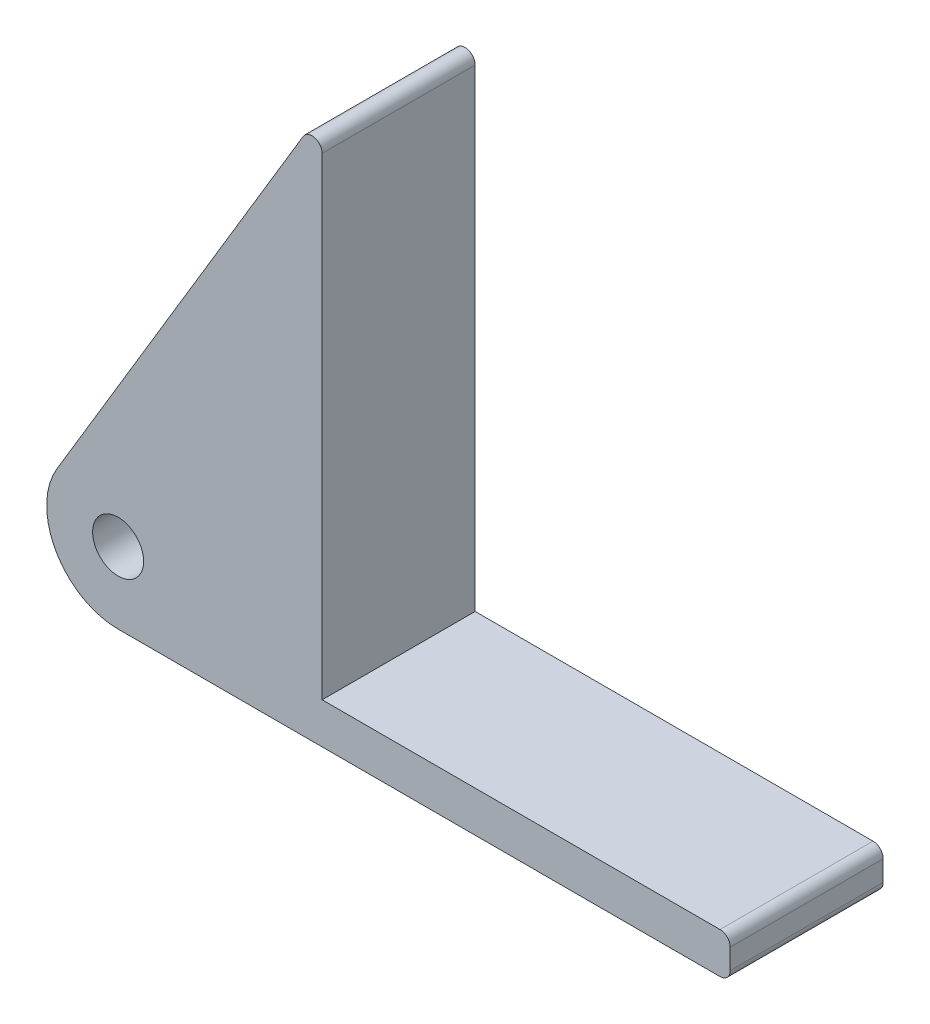
ISO-10303-21;
HEADER;
FILE_DESCRIPTION(('STEP AP214'),'2;1');
FILE_NAME('part.step','',(''),(''),'','','');
FILE_SCHEMA(('AUTOMOTIVE_DESIGN { 1 0 10303 214 1 1 1 1 }'));
ENDSEC;
DATA;
#1=APPLICATION_CONTEXT('core data for automotive mechanical design processes');
#2=APPLICATION_PROTOCOL_DEFINITION('international standard','automotive_design',2000,#1);
#3=PRODUCT_CONTEXT('',#1,'mechanical');
#4=PRODUCT('Part','Part','',(#3));
#5=PRODUCT_RELATED_PRODUCT_CATEGORY('part','',(#4));
#6=PRODUCT_DEFINITION_FORMATION('','',#4);
#7=PRODUCT_DEFINITION_CONTEXT('part definition',#1,'design');
#8=PRODUCT_DEFINITION('design','',#6,#7);
#9=PRODUCT_DEFINITION_SHAPE('','',#8);
#10=(LENGTH_UNIT() NAMED_UNIT(*) SI_UNIT(.MILLI.,.METRE.));
#11=(NAMED_UNIT(*) PLANE_ANGLE_UNIT() SI_UNIT($,.RADIAN.));
#12=(NAMED_UNIT(*) SI_UNIT($,.STERADIAN.) SOLID_ANGLE_UNIT());
#13=UNCERTAINTY_MEASURE_WITH_UNIT(LENGTH_MEASURE(1.E-05),#10,'distance_accuracy_value','');
#14=(GEOMETRIC_REPRESENTATION_CONTEXT(3) GLOBAL_UNCERTAINTY_ASSIGNED_CONTEXT((#13)) GLOBAL_UNIT_ASSIGNED_CONTEXT((#10,
#11,#12)) REPRESENTATION_CONTEXT('',''));
#15=CARTESIAN_POINT('',(0.,0.,0.));
#16=DIRECTION('',(0.,0.,1.));
#17=DIRECTION('',(1.,0.,0.));
#18=AXIS2_PLACEMENT_3D('',#15,#16,#17);
#19=CARTESIAN_POINT('',(0.,-3.00000000000001,-15.));
#20=DIRECTION('',(0.,1.,0.));
#21=DIRECTION('',(-1.,0.,0.));
#22=AXIS2_PLACEMENT_3D('',#19,#20,#21);
#23=PLANE('',#22);
#24=DIRECTION('',(-1.,0.,0.));
#25=VECTOR('',#24,1.);
#26=CARTESIAN_POINT('',(0.,-3.00000000000001,0.));
#27=LINE('',#26,#25);
#28=CARTESIAN_POINT('',(59.,-3.,0.));
#29=VERTEX_POINT('',#28);
#30=CARTESIAN_POINT('',(20.,-3.00000000000001,0.));
#31=VERTEX_POINT('',#30);
#32=EDGE_CURVE('E163',#29,#31,#27,.T.);
#33=ORIENTED_EDGE('',*,*,#32,.F.);
#34=DIRECTION('',(0.,0.,1.));
#35=VECTOR('',#34,1.);
#36=CARTESIAN_POINT('',(59.,-3.,-15.));
#37=LINE('',#36,#35);
#38=CARTESIAN_POINT('',(59.,-3.,-15.));
#39=VERTEX_POINT('',#38);
#40=EDGE_CURVE('E123',#29,#39,#37,.F.);
#41=ORIENTED_EDGE('',*,*,#40,.T.);
#42=DIRECTION('',(-1.,0.,0.));
#43=VECTOR('',#42,1.);
#44=CARTESIAN_POINT('',(0.,-3.00000000000001,-15.));
#45=LINE('',#44,#43);
#46=CARTESIAN_POINT('',(20.,-3.00000000000001,-15.));
#47=VERTEX_POINT('',#46);
#48=EDGE_CURVE('E117',#39,#47,#45,.T.);
#49=ORIENTED_EDGE('',*,*,#48,.T.);
#50=DIRECTION('',(0.,0.,1.));
#51=VECTOR('',#50,1.);
#52=CARTESIAN_POINT('',(20.,-3.00000000000001,-15.));
#53=LINE('',#52,#51);
#54=EDGE_CURVE('E120',#47,#31,#53,.T.);
#55=ORIENTED_EDGE('',*,*,#54,.T.);
#56=EDGE_LOOP('',(#33,#41,#49,#55));
#57=FACE_BOUND('',#56,.T.);
#58=ADVANCED_FACE('F45',(#57),#23,.T.);
#59=CARTESIAN_POINT('',(60.,0.,-15.));
#60=DIRECTION('',(1.,0.,0.));
#61=DIRECTION('',(0.,0.,-1.));
#62=AXIS2_PLACEMENT_3D('',#59,#60,#61);
#63=PLANE('',#62);
#64=DIRECTION('',(0.,1.,0.));
#65=VECTOR('',#64,1.);
#66=CARTESIAN_POINT('',(60.,0.,0.));
#67=LINE('',#66,#65);
#68=CARTESIAN_POINT('',(60.,-6.,0.));
#69=VERTEX_POINT('',#68);
#70=CARTESIAN_POINT('',(60.,-4.,0.));
#71=VERTEX_POINT('',#70);
#72=EDGE_CURVE('E179',#69,#71,#67,.T.);
#73=ORIENTED_EDGE('',*,*,#72,.F.);
#74=DIRECTION('',(0.,0.,1.));
#75=VECTOR('',#74,1.);
#76=CARTESIAN_POINT('',(60.,-6.,-15.));
#77=LINE('',#76,#75);
#78=CARTESIAN_POINT('',(60.,-6.,-15.));
#79=VERTEX_POINT('',#78);
#80=EDGE_CURVE('E209',#69,#79,#77,.F.);
#81=ORIENTED_EDGE('',*,*,#80,.T.);
#82=DIRECTION('',(0.,1.,0.));
#83=VECTOR('',#82,1.);
#84=CARTESIAN_POINT('',(60.,0.,-15.));
#85=LINE('',#84,#83);
#86=CARTESIAN_POINT('',(60.,-4.,-15.));
#87=VERTEX_POINT('',#86);
#88=EDGE_CURVE('E156',#79,#87,#85,.T.);
#89=ORIENTED_EDGE('',*,*,#88,.T.);
#90=DIRECTION('',(0.,0.,1.));
#91=VECTOR('',#90,1.);
#92=CARTESIAN_POINT('',(60.,-4.,-15.));
#93=LINE('',#92,#91);
#94=EDGE_CURVE('E205',#87,#71,#93,.T.);
#95=ORIENTED_EDGE('',*,*,#94,.T.);
#96=EDGE_LOOP('',(#73,#81,#89,#95));
#97=FACE_BOUND('',#96,.T.);
#98=ADVANCED_FACE('F232',(#97),#63,.T.);
#99=CARTESIAN_POINT('',(0.,-7.,-15.));
#100=DIRECTION('',(0.,-1.,0.));
#101=DIRECTION('',(0.,0.,-1.));
#102=AXIS2_PLACEMENT_3D('',#99,#100,#101);
#103=PLANE('',#102);
#104=DIRECTION('',(1.,0.,0.));
#105=VECTOR('',#104,1.);
#106=CARTESIAN_POINT('',(0.,-7.,-15.));
#107=LINE('',#106,#105);
#108=CARTESIAN_POINT('',(0.,-7.,-15.));
#109=VERTEX_POINT('',#108);
#110=CARTESIAN_POINT('',(59.,-7.,-15.));
#111=VERTEX_POINT('',#110);
#112=EDGE_CURVE('E152',#109,#111,#107,.T.);
#113=ORIENTED_EDGE('',*,*,#112,.T.);
#114=DIRECTION('',(0.,0.,1.));
#115=VECTOR('',#114,1.);
#116=CARTESIAN_POINT('',(59.,-7.,-15.));
#117=LINE('',#116,#115);
#118=CARTESIAN_POINT('',(59.,-7.,0.));
#119=VERTEX_POINT('',#118);
#120=EDGE_CURVE('E189',#111,#119,#117,.T.);
#121=ORIENTED_EDGE('',*,*,#120,.T.);
#122=DIRECTION('',(1.,0.,0.));
#123=VECTOR('',#122,1.);
#124=CARTESIAN_POINT('',(0.,-7.,0.));
#125=LINE('',#124,#123);
#126=CARTESIAN_POINT('',(0.,-7.,0.));
#127=VERTEX_POINT('',#126);
#128=EDGE_CURVE('E175',#127,#119,#125,.T.);
#129=ORIENTED_EDGE('',*,*,#128,.F.);
#130=DIRECTION('',(0.,0.,1.));
#131=VECTOR('',#130,1.);
#132=CARTESIAN_POINT('',(0.,-7.,-15.));
#133=LINE('',#132,#131);
#134=EDGE_CURVE('E186',#109,#127,#133,.T.);
#135=ORIENTED_EDGE('',*,*,#134,.F.);
#136=EDGE_LOOP('',(#113,#121,#129,#135));
#137=FACE_BOUND('',#136,.T.);
#138=ADVANCED_FACE('F240',(#137),#103,.T.);
#139=CARTESIAN_POINT('',(0.,0.,-15.));
#140=DIRECTION('',(0.,0.,1.));
#141=DIRECTION('',(1.,0.,0.));
#142=AXIS2_PLACEMENT_3D('',#139,#140,#141);
#143=CYLINDRICAL_SURFACE('',#142,7.);
#144=CARTESIAN_POINT('',(0.,0.,0.));
#145=DIRECTION('',(0.,0.,1.));
#146=DIRECTION('',(1.,0.,0.));
#147=AXIS2_PLACEMENT_3D('',#144,#145,#146);
#148=CIRCLE('',#147,7.);
#149=CARTESIAN_POINT('',(-6.00468746766054,3.59773934794066,0.));
#150=VERTEX_POINT('',#149);
#151=EDGE_CURVE('E171',#150,#127,#148,.T.);
#152=ORIENTED_EDGE('',*,*,#151,.F.);
#153=DIRECTION('',(0.,0.,1.));
#154=VECTOR('',#153,1.);
#155=CARTESIAN_POINT('',(-6.00468746766054,3.59773934794066,-15.));
#156=LINE('',#155,#154);
#157=CARTESIAN_POINT('',(-6.00468746766054,3.59773934794066,-15.));
#158=VERTEX_POINT('',#157);
#159=EDGE_CURVE('E136',#158,#150,#156,.T.);
#160=ORIENTED_EDGE('',*,*,#159,.F.);
#161=CARTESIAN_POINT('',(0.,0.,-15.));
#162=DIRECTION('',(0.,0.,1.));
#163=DIRECTION('',(1.,0.,0.));
#164=AXIS2_PLACEMENT_3D('',#161,#162,#163);
#165=CIRCLE('',#164,7.);
#166=EDGE_CURVE('E146',#158,#109,#165,.T.);
#167=ORIENTED_EDGE('',*,*,#166,.T.);
#168=ORIENTED_EDGE('',*,*,#134,.T.);
#169=EDGE_LOOP('',(#152,#160,#167,#168));
#170=FACE_BOUND('',#169,.T.);
#171=ADVANCED_FACE('F244',(#170),#143,.T.);
#172=CARTESIAN_POINT('',(-6.00468746766054,3.59773934794066,-15.));
#173=DIRECTION('',(-0.857812495380077,0.513962763991522,0.));
#174=DIRECTION('',(-0.513962763991522,-0.857812495380077,0.));
#175=AXIS2_PLACEMENT_3D('',#172,#173,#174);
#176=PLANE('',#175);
#177=DIRECTION('',(-0.513962763991522,-0.857812495380077,0.));
#178=VECTOR('',#177,1.);
#179=CARTESIAN_POINT('',(-6.00468746766054,3.59773934794066,0.));
#180=LINE('',#179,#178);
#181=CARTESIAN_POINT('',(18.1421875046199,43.899279706114,0.));
#182=VERTEX_POINT('',#181);
#183=EDGE_CURVE('E168',#182,#150,#180,.T.);
#184=ORIENTED_EDGE('',*,*,#183,.F.);
#185=DIRECTION('',(0.,0.,1.));
#186=VECTOR('',#185,1.);
#187=CARTESIAN_POINT('',(18.1421875046199,43.899279706114,-15.));
#188=LINE('',#187,#186);
#189=CARTESIAN_POINT('',(18.1421875046199,43.899279706114,-15.));
#190=VERTEX_POINT('',#189);
#191=EDGE_CURVE('E11',#182,#190,#188,.F.);
#192=ORIENTED_EDGE('',*,*,#191,.T.);
#193=DIRECTION('',(-0.513962763991522,-0.857812495380077,0.));
#194=VECTOR('',#193,1.);
#195=CARTESIAN_POINT('',(-6.00468746766054,3.59773934794066,-15.));
#196=LINE('',#195,#194);
#197=EDGE_CURVE('E143',#190,#158,#196,.T.);
#198=ORIENTED_EDGE('',*,*,#197,.T.);
#199=ORIENTED_EDGE('',*,*,#159,.T.);
#200=EDGE_LOOP('',(#184,#192,#198,#199));
#201=FACE_BOUND('',#200,.T.);
#202=ADVANCED_FACE('F276',(#201),#176,.T.);
#203=CARTESIAN_POINT('',(20.,0.,-15.));
#204=DIRECTION('',(1.,0.,0.));
#205=DIRECTION('',(0.,0.,-1.));
#206=AXIS2_PLACEMENT_3D('',#203,#204,#205);
#207=PLANE('',#206);
#208=DIRECTION('',(0.,1.,0.));
#209=VECTOR('',#208,1.);
#210=CARTESIAN_POINT('',(20.,0.,-15.));
#211=LINE('',#210,#209);
#212=CARTESIAN_POINT('',(20.,43.3853169421224,-15.));
#213=VERTEX_POINT('',#212);
#214=EDGE_CURVE('E126',#47,#213,#211,.T.);
#215=ORIENTED_EDGE('',*,*,#214,.T.);
#216=DIRECTION('',(0.,0.,1.));
#217=VECTOR('',#216,1.);
#218=CARTESIAN_POINT('',(20.,43.3853169421224,-15.));
#219=LINE('',#218,#217);
#220=CARTESIAN_POINT('',(20.,43.3853169421224,0.));
#221=VERTEX_POINT('',#220);
#222=EDGE_CURVE('E54',#213,#221,#219,.T.);
#223=ORIENTED_EDGE('',*,*,#222,.T.);
#224=DIRECTION('',(0.,1.,0.));
#225=VECTOR('',#224,1.);
#226=CARTESIAN_POINT('',(20.,0.,0.));
#227=LINE('',#226,#225);
#228=EDGE_CURVE('E134',#31,#221,#227,.T.);
#229=ORIENTED_EDGE('',*,*,#228,.F.);
#230=ORIENTED_EDGE('',*,*,#54,.F.);
#231=EDGE_LOOP('',(#215,#223,#229,#230));
#232=FACE_BOUND('',#231,.T.);
#233=ADVANCED_FACE('F130',(#232),#207,.T.);
#234=CARTESIAN_POINT('',(0.,0.,-15.));
#235=DIRECTION('',(0.,0.,1.));
#236=DIRECTION('',(1.,0.,0.));
#237=AXIS2_PLACEMENT_3D('',#234,#235,#236);
#238=CYLINDRICAL_SURFACE('',#237,2.5);
#239=CARTESIAN_POINT('',(0.,0.,-15.));
#240=DIRECTION('',(0.,0.,1.));
#241=DIRECTION('',(1.,0.,0.));
#242=AXIS2_PLACEMENT_3D('',#239,#240,#241);
#243=CIRCLE('',#242,2.5);
#244=CARTESIAN_POINT('',(2.5,0.,-15.));
#245=VERTEX_POINT('',#244);
#246=EDGE_CURVE('E137',#245,#245,#243,.T.);
#247=ORIENTED_EDGE('',*,*,#246,.F.);
#248=EDGE_LOOP('',(#247));
#249=FACE_BOUND('',#248,.T.);
#250=CARTESIAN_POINT('',(0.,0.,0.));
#251=DIRECTION('',(0.,0.,1.));
#252=DIRECTION('',(1.,0.,0.));
#253=AXIS2_PLACEMENT_3D('',#250,#251,#252);
#254=CIRCLE('',#253,2.5);
#255=CARTESIAN_POINT('',(2.5,0.,0.));
#256=VERTEX_POINT('',#255);
#257=EDGE_CURVE('E127',#256,#256,#254,.T.);
#258=ORIENTED_EDGE('',*,*,#257,.T.);
#259=EDGE_LOOP('',(#258));
#260=FACE_BOUND('',#259,.T.);
#261=ADVANCED_FACE('F267',(#249,#260),#238,.F.);
#262=CARTESIAN_POINT('',(0.,0.,-15.));
#263=DIRECTION('',(0.,0.,1.));
#264=DIRECTION('',(1.,0.,0.));
#265=AXIS2_PLACEMENT_3D('',#262,#263,#264);
#266=PLANE('',#265);
#267=ORIENTED_EDGE('',*,*,#88,.F.);
#268=CARTESIAN_POINT('',(59.,-6.,-15.));
#269=DIRECTION('',(0.,0.,1.));
#270=DIRECTION('',(1.,0.,0.));
#271=AXIS2_PLACEMENT_3D('',#268,#269,#270);
#272=CIRCLE('',#271,1.);
#273=EDGE_CURVE('E217',#79,#111,#272,.F.);
#274=ORIENTED_EDGE('',*,*,#273,.T.);
#275=ORIENTED_EDGE('',*,*,#112,.F.);
#276=ORIENTED_EDGE('',*,*,#166,.F.);
#277=ORIENTED_EDGE('',*,*,#197,.F.);
#278=CARTESIAN_POINT('',(19.,43.3853169421224,-15.));
#279=DIRECTION('',(0.,0.,1.));
#280=DIRECTION('',(1.,0.,0.));
#281=AXIS2_PLACEMENT_3D('',#278,#279,#280);
#282=CIRCLE('',#281,1.);
#283=EDGE_CURVE('E61',#190,#213,#282,.F.);
#284=ORIENTED_EDGE('',*,*,#283,.T.);
#285=ORIENTED_EDGE('',*,*,#214,.F.);
#286=ORIENTED_EDGE('',*,*,#48,.F.);
#287=CARTESIAN_POINT('',(59.,-4.,-15.));
#288=DIRECTION('',(0.,0.,1.));
#289=DIRECTION('',(1.,0.,0.));
#290=AXIS2_PLACEMENT_3D('',#287,#288,#289);
#291=CIRCLE('',#290,1.);
#292=EDGE_CURVE('E214',#39,#87,#291,.F.);
#293=ORIENTED_EDGE('',*,*,#292,.T.);
#294=EDGE_LOOP('',(#267,#274,#275,#276,#277,#284,#285,#286,#293));
#295=FACE_BOUND('',#294,.T.);
#296=ORIENTED_EDGE('',*,*,#246,.T.);
#297=EDGE_LOOP('',(#296));
#298=FACE_BOUND('',#297,.T.);
#299=ADVANCED_FACE('F140',(#295,#298),#266,.F.);
#300=CARTESIAN_POINT('',(0.,0.,0.));
#301=DIRECTION('',(0.,0.,1.));
#302=DIRECTION('',(1.,0.,0.));
#303=AXIS2_PLACEMENT_3D('',#300,#301,#302);
#304=PLANE('',#303);
#305=ORIENTED_EDGE('',*,*,#128,.T.);
#306=CARTESIAN_POINT('',(59.,-6.,0.));
#307=DIRECTION('',(0.,0.,1.));
#308=DIRECTION('',(1.,0.,0.));
#309=AXIS2_PLACEMENT_3D('',#306,#307,#308);
#310=CIRCLE('',#309,1.);
#311=EDGE_CURVE('E202',#119,#69,#310,.T.);
#312=ORIENTED_EDGE('',*,*,#311,.T.);
#313=ORIENTED_EDGE('',*,*,#72,.T.);
#314=CARTESIAN_POINT('',(59.,-4.,0.));
#315=DIRECTION('',(0.,0.,1.));
#316=DIRECTION('',(1.,0.,0.));
#317=AXIS2_PLACEMENT_3D('',#314,#315,#316);
#318=CIRCLE('',#317,1.);
#319=EDGE_CURVE('E199',#71,#29,#318,.T.);
#320=ORIENTED_EDGE('',*,*,#319,.T.);
#321=ORIENTED_EDGE('',*,*,#32,.T.);
#322=ORIENTED_EDGE('',*,*,#228,.T.);
#323=CARTESIAN_POINT('',(19.,43.3853169421224,0.));
#324=DIRECTION('',(0.,0.,1.));
#325=DIRECTION('',(1.,0.,0.));
#326=AXIS2_PLACEMENT_3D('',#323,#324,#325);
#327=CIRCLE('',#326,1.);
#328=EDGE_CURVE('E196',#221,#182,#327,.T.);
#329=ORIENTED_EDGE('',*,*,#328,.T.);
#330=ORIENTED_EDGE('',*,*,#183,.T.);
#331=ORIENTED_EDGE('',*,*,#151,.T.);
#332=EDGE_LOOP('',(#305,#312,#313,#320,#321,#322,#329,#330,#331));
#333=FACE_BOUND('',#332,.T.);
#334=ORIENTED_EDGE('',*,*,#257,.F.);
#335=EDGE_LOOP('',(#334));
#336=FACE_BOUND('',#335,.T.);
#337=ADVANCED_FACE('F224',(#333,#336),#304,.T.);
#338=CARTESIAN_POINT('',(59.,-6.,-15.));
#339=DIRECTION('',(0.,0.,1.));
#340=DIRECTION('',(1.,0.,0.));
#341=AXIS2_PLACEMENT_3D('',#338,#339,#340);
#342=CYLINDRICAL_SURFACE('',#341,1.);
#343=ORIENTED_EDGE('',*,*,#273,.F.);
#344=ORIENTED_EDGE('',*,*,#80,.F.);
#345=ORIENTED_EDGE('',*,*,#311,.F.);
#346=ORIENTED_EDGE('',*,*,#120,.F.);
#347=EDGE_LOOP('',(#343,#344,#345,#346));
#348=FACE_BOUND('',#347,.T.);
#349=ADVANCED_FACE('F235',(#348),#342,.T.);
#350=CARTESIAN_POINT('',(59.,-4.,-15.));
#351=DIRECTION('',(0.,0.,1.));
#352=DIRECTION('',(1.,0.,0.));
#353=AXIS2_PLACEMENT_3D('',#350,#351,#352);
#354=CYLINDRICAL_SURFACE('',#353,1.);
#355=ORIENTED_EDGE('',*,*,#292,.F.);
#356=ORIENTED_EDGE('',*,*,#40,.F.);
#357=ORIENTED_EDGE('',*,*,#319,.F.);
#358=ORIENTED_EDGE('',*,*,#94,.F.);
#359=EDGE_LOOP('',(#355,#356,#357,#358));
#360=FACE_BOUND('',#359,.T.);
#361=ADVANCED_FACE('F227',(#360),#354,.T.);
#362=CARTESIAN_POINT('',(19.,43.3853169421224,-15.));
#363=DIRECTION('',(0.,0.,1.));
#364=DIRECTION('',(1.,0.,0.));
#365=AXIS2_PLACEMENT_3D('',#362,#363,#364);
#366=CYLINDRICAL_SURFACE('',#365,1.);
#367=ORIENTED_EDGE('',*,*,#283,.F.);
#368=ORIENTED_EDGE('',*,*,#191,.F.);
#369=ORIENTED_EDGE('',*,*,#328,.F.);
#370=ORIENTED_EDGE('',*,*,#222,.F.);
#371=EDGE_LOOP('',(#367,#368,#369,#370));
#372=FACE_BOUND('',#371,.T.);
#373=ADVANCED_FACE('F47',(#372),#366,.T.);
#374=CLOSED_SHELL('',(#58,#98,#138,#171,#202,#233,#261,#299,#337,#349,#361,#373));
#375=MANIFOLD_SOLID_BREP('B2',#374);
#376=ADVANCED_BREP_SHAPE_REPRESENTATION('',(#18,#375),#14);
#377=SHAPE_DEFINITION_REPRESENTATION(#9,#376);
ENDSEC;
END-ISO-10303-21;
